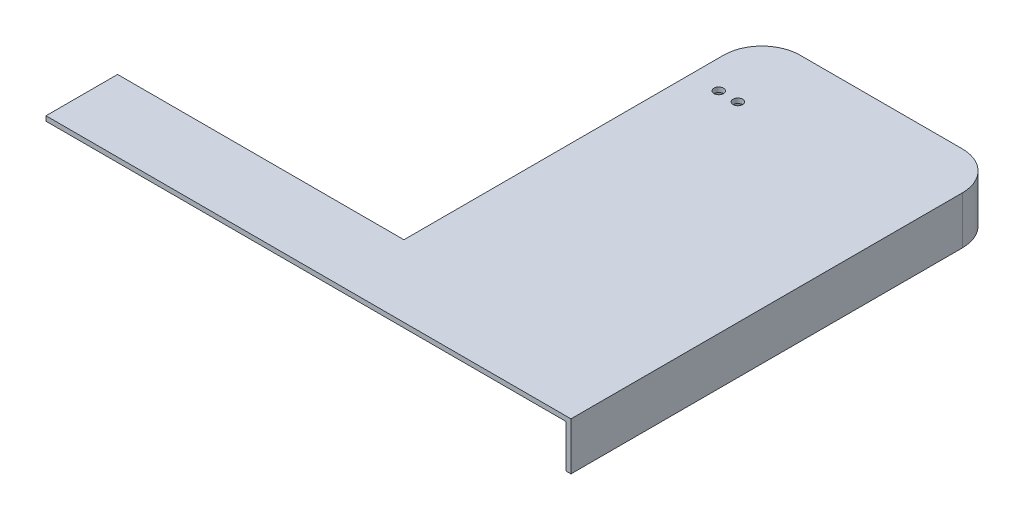
ISO-10303-21;
HEADER;
FILE_DESCRIPTION(('STEP AP214'),'2;1');
FILE_NAME('part.step','',(''),(''),'','','');
FILE_SCHEMA(('AUTOMOTIVE_DESIGN { 1 0 10303 214 1 1 1 1 }'));
ENDSEC;
DATA;
#1=APPLICATION_CONTEXT('core data for automotive mechanical design processes');
#2=APPLICATION_PROTOCOL_DEFINITION('international standard','automotive_design',2000,#1);
#3=PRODUCT_CONTEXT('',#1,'mechanical');
#4=PRODUCT('Part','Part','',(#3));
#5=PRODUCT_RELATED_PRODUCT_CATEGORY('part','',(#4));
#6=PRODUCT_DEFINITION_FORMATION('','',#4);
#7=PRODUCT_DEFINITION_CONTEXT('part definition',#1,'design');
#8=PRODUCT_DEFINITION('design','',#6,#7);
#9=PRODUCT_DEFINITION_SHAPE('','',#8);
#10=(LENGTH_UNIT() NAMED_UNIT(*) SI_UNIT(.MILLI.,.METRE.));
#11=(NAMED_UNIT(*) PLANE_ANGLE_UNIT() SI_UNIT($,.RADIAN.));
#12=(NAMED_UNIT(*) SI_UNIT($,.STERADIAN.) SOLID_ANGLE_UNIT());
#13=UNCERTAINTY_MEASURE_WITH_UNIT(LENGTH_MEASURE(1.E-05),#10,'distance_accuracy_value','');
#14=(GEOMETRIC_REPRESENTATION_CONTEXT(3) GLOBAL_UNCERTAINTY_ASSIGNED_CONTEXT((#13)) GLOBAL_UNIT_ASSIGNED_CONTEXT((#10,
#11,#12)) REPRESENTATION_CONTEXT('',''));
#15=CARTESIAN_POINT('',(0.,0.,0.));
#16=DIRECTION('',(0.,0.,1.));
#17=DIRECTION('',(1.,0.,0.));
#18=AXIS2_PLACEMENT_3D('',#15,#16,#17);
#19=CARTESIAN_POINT('',(0.,25.4,-12.7));
#20=DIRECTION('',(0.,0.,-1.));
#21=DIRECTION('',(-1.,0.,0.));
#22=AXIS2_PLACEMENT_3D('',#19,#20,#21);
#23=PLANE('',#22);
#24=DIRECTION('',(1.,0.,0.));
#25=VECTOR('',#24,1.);
#26=CARTESIAN_POINT('',(0.,0.,-12.7));
#27=LINE('',#26,#25);
#28=CARTESIAN_POINT('',(0.,0.,-12.7));
#29=VERTEX_POINT('',#28);
#30=CARTESIAN_POINT('',(152.4,0.,-12.7));
#31=VERTEX_POINT('',#30);
#32=EDGE_CURVE('E166',#29,#31,#27,.T.);
#33=ORIENTED_EDGE('',*,*,#32,.F.);
#34=DIRECTION('',(0.,1.,0.));
#35=VECTOR('',#34,1.);
#36=CARTESIAN_POINT('',(0.,0.,-12.7));
#37=LINE('',#36,#35);
#38=CARTESIAN_POINT('',(0.,25.4,-12.7));
#39=VERTEX_POINT('',#38);
#40=EDGE_CURVE('E148',#29,#39,#37,.T.);
#41=ORIENTED_EDGE('',*,*,#40,.T.);
#42=DIRECTION('',(1.,0.,0.));
#43=VECTOR('',#42,1.);
#44=CARTESIAN_POINT('',(0.,25.4,-12.7));
#45=LINE('',#44,#43);
#46=CARTESIAN_POINT('',(152.4,25.4,-12.7));
#47=VERTEX_POINT('',#46);
#48=EDGE_CURVE('E319',#39,#47,#45,.T.);
#49=ORIENTED_EDGE('',*,*,#48,.T.);
#50=DIRECTION('',(0.,-1.,0.));
#51=VECTOR('',#50,1.);
#52=CARTESIAN_POINT('',(152.4,25.4,-12.7));
#53=LINE('',#52,#51);
#54=EDGE_CURVE('E174',#47,#31,#53,.T.);
#55=ORIENTED_EDGE('',*,*,#54,.T.);
#56=EDGE_LOOP('',(#33,#41,#49,#55));
#57=FACE_BOUND('',#56,.T.);
#58=ADVANCED_FACE('F40',(#57),#23,.T.);
#59=CARTESIAN_POINT('',(0.,25.4,0.));
#60=DIRECTION('',(0.,1.,0.));
#61=DIRECTION('',(0.,0.,1.));
#62=AXIS2_PLACEMENT_3D('',#59,#60,#61);
#63=PLANE('',#62);
#64=CARTESIAN_POINT('',(177.72,25.4,-165.1));
#65=DIRECTION('',(0.,1.,0.));
#66=DIRECTION('',(0.,0.,1.));
#67=AXIS2_PLACEMENT_3D('',#64,#65,#66);
#68=CIRCLE('',#67,2.54000000000001);
#69=CARTESIAN_POINT('',(177.72,25.4,-162.56));
#70=VERTEX_POINT('',#69);
#71=EDGE_CURVE('E251',#70,#70,#68,.T.);
#72=ORIENTED_EDGE('',*,*,#71,.F.);
#73=EDGE_LOOP('',(#72));
#74=FACE_BOUND('',#73,.T.);
#75=CARTESIAN_POINT('',(167.56,25.4,-165.1));
#76=DIRECTION('',(0.,1.,0.));
#77=DIRECTION('',(0.,0.,1.));
#78=AXIS2_PLACEMENT_3D('',#75,#76,#77);
#79=CIRCLE('',#78,2.54000000000001);
#80=CARTESIAN_POINT('',(167.56,25.4,-162.56));
#81=VERTEX_POINT('',#80);
#82=EDGE_CURVE('E223',#81,#81,#79,.T.);
#83=ORIENTED_EDGE('',*,*,#82,.F.);
#84=EDGE_LOOP('',(#83));
#85=FACE_BOUND('',#84,.T.);
#86=ORIENTED_EDGE('',*,*,#48,.F.);
#87=DIRECTION('',(0.,0.,1.));
#88=VECTOR('',#87,1.);
#89=CARTESIAN_POINT('',(0.,25.4,0.));
#90=LINE('',#89,#88);
#91=CARTESIAN_POINT('',(0.,25.4,25.4));
#92=VERTEX_POINT('',#91);
#93=EDGE_CURVE('E154',#39,#92,#90,.T.);
#94=ORIENTED_EDGE('',*,*,#93,.T.);
#95=DIRECTION('',(-1.,0.,0.));
#96=VECTOR('',#95,1.);
#97=CARTESIAN_POINT('',(0.,25.4,25.4));
#98=LINE('',#97,#96);
#99=CARTESIAN_POINT('',(279.4,25.4,25.4));
#100=VERTEX_POINT('',#99);
#101=EDGE_CURVE('E170',#100,#92,#98,.T.);
#102=ORIENTED_EDGE('',*,*,#101,.F.);
#103=DIRECTION('',(0.,0.,-1.));
#104=VECTOR('',#103,1.);
#105=CARTESIAN_POINT('',(279.4,25.4,0.));
#106=LINE('',#105,#104);
#107=CARTESIAN_POINT('',(279.4,25.4,-182.88));
#108=VERTEX_POINT('',#107);
#109=EDGE_CURVE('E190',#100,#108,#106,.T.);
#110=ORIENTED_EDGE('',*,*,#109,.T.);
#111=CARTESIAN_POINT('',(259.08,25.4,-182.88));
#112=DIRECTION('',(0.,1.,0.));
#113=DIRECTION('',(0.,0.,1.));
#114=AXIS2_PLACEMENT_3D('',#111,#112,#113);
#115=CIRCLE('',#114,20.32);
#116=CARTESIAN_POINT('',(259.08,25.4,-203.2));
#117=VERTEX_POINT('',#116);
#118=EDGE_CURVE('E211',#108,#117,#115,.T.);
#119=ORIENTED_EDGE('',*,*,#118,.T.);
#120=DIRECTION('',(1.,0.,0.));
#121=VECTOR('',#120,1.);
#122=CARTESIAN_POINT('',(0.,25.4,-203.2));
#123=LINE('',#122,#121);
#124=CARTESIAN_POINT('',(172.72,25.4,-203.2));
#125=VERTEX_POINT('',#124);
#126=EDGE_CURVE('E181',#125,#117,#123,.T.);
#127=ORIENTED_EDGE('',*,*,#126,.F.);
#128=CARTESIAN_POINT('',(172.72,25.4,-182.88));
#129=DIRECTION('',(0.,1.,0.));
#130=DIRECTION('',(0.,0.,1.));
#131=AXIS2_PLACEMENT_3D('',#128,#129,#130);
#132=CIRCLE('',#131,20.32);
#133=CARTESIAN_POINT('',(152.4,25.4,-182.88));
#134=VERTEX_POINT('',#133);
#135=EDGE_CURVE('E208',#125,#134,#132,.T.);
#136=ORIENTED_EDGE('',*,*,#135,.T.);
#137=DIRECTION('',(0.,0.,1.));
#138=VECTOR('',#137,1.);
#139=CARTESIAN_POINT('',(152.4,25.4,0.));
#140=LINE('',#139,#138);
#141=EDGE_CURVE('E315',#134,#47,#140,.T.);
#142=ORIENTED_EDGE('',*,*,#141,.T.);
#143=EDGE_LOOP('',(#86,#94,#102,#110,#119,#127,#136,#142));
#144=FACE_BOUND('',#143,.T.);
#145=ADVANCED_FACE('F338',(#74,#85,#144),#63,.T.);
#146=CARTESIAN_POINT('',(0.,0.,0.));
#147=DIRECTION('',(0.,1.,0.));
#148=DIRECTION('',(0.,0.,1.));
#149=AXIS2_PLACEMENT_3D('',#146,#147,#148);
#150=PLANE('',#149);
#151=DIRECTION('',(0.,0.,1.));
#152=VECTOR('',#151,1.);
#153=CARTESIAN_POINT('',(0.,0.,0.));
#154=LINE('',#153,#152);
#155=CARTESIAN_POINT('',(0.,0.,-10.16));
#156=VERTEX_POINT('',#155);
#157=EDGE_CURVE('E151',#29,#156,#154,.T.);
#158=ORIENTED_EDGE('',*,*,#157,.F.);
#159=ORIENTED_EDGE('',*,*,#32,.T.);
#160=DIRECTION('',(0.,0.,1.));
#161=VECTOR('',#160,1.);
#162=CARTESIAN_POINT('',(152.4,0.,0.));
#163=LINE('',#162,#161);
#164=CARTESIAN_POINT('',(152.4,0.,-182.88));
#165=VERTEX_POINT('',#164);
#166=EDGE_CURVE('E177',#165,#31,#163,.T.);
#167=ORIENTED_EDGE('',*,*,#166,.F.);
#168=CARTESIAN_POINT('',(172.72,0.,-182.88));
#169=DIRECTION('',(0.,1.,0.));
#170=DIRECTION('',(0.,0.,1.));
#171=AXIS2_PLACEMENT_3D('',#168,#169,#170);
#172=CIRCLE('',#171,20.32);
#173=CARTESIAN_POINT('',(172.72,0.,-203.2));
#174=VERTEX_POINT('',#173);
#175=EDGE_CURVE('E197',#165,#174,#172,.F.);
#176=ORIENTED_EDGE('',*,*,#175,.T.);
#177=DIRECTION('',(1.,0.,0.));
#178=VECTOR('',#177,1.);
#179=CARTESIAN_POINT('',(0.,0.,-203.2));
#180=LINE('',#179,#178);
#181=CARTESIAN_POINT('',(259.08,0.,-203.2));
#182=VERTEX_POINT('',#181);
#183=EDGE_CURVE('E183',#174,#182,#180,.T.);
#184=ORIENTED_EDGE('',*,*,#183,.T.);
#185=CARTESIAN_POINT('',(259.08,0.,-182.88));
#186=DIRECTION('',(0.,1.,0.));
#187=DIRECTION('',(0.,0.,1.));
#188=AXIS2_PLACEMENT_3D('',#185,#186,#187);
#189=CIRCLE('',#188,20.32);
#190=CARTESIAN_POINT('',(279.4,0.,-182.88));
#191=VERTEX_POINT('',#190);
#192=EDGE_CURVE('E200',#182,#191,#189,.F.);
#193=ORIENTED_EDGE('',*,*,#192,.T.);
#194=DIRECTION('',(0.,0.,-1.));
#195=VECTOR('',#194,1.);
#196=CARTESIAN_POINT('',(279.4,0.,0.));
#197=LINE('',#196,#195);
#198=CARTESIAN_POINT('',(279.4,0.,25.4));
#199=VERTEX_POINT('',#198);
#200=EDGE_CURVE('E176',#199,#191,#197,.T.);
#201=ORIENTED_EDGE('',*,*,#200,.F.);
#202=DIRECTION('',(-1.,0.,0.));
#203=VECTOR('',#202,1.);
#204=CARTESIAN_POINT('',(0.,0.,25.4));
#205=LINE('',#204,#203);
#206=CARTESIAN_POINT('',(276.86,0.,25.4));
#207=VERTEX_POINT('',#206);
#208=EDGE_CURVE('E160',#199,#207,#205,.T.);
#209=ORIENTED_EDGE('',*,*,#208,.T.);
#210=DIRECTION('',(0.,0.,-1.));
#211=VECTOR('',#210,1.);
#212=CARTESIAN_POINT('',(276.86,0.,0.));
#213=LINE('',#212,#211);
#214=CARTESIAN_POINT('',(276.86,0.,-182.88));
#215=VERTEX_POINT('',#214);
#216=EDGE_CURVE('E245',#207,#215,#213,.T.);
#217=ORIENTED_EDGE('',*,*,#216,.T.);
#218=CARTESIAN_POINT('',(259.08,0.,-182.88));
#219=DIRECTION('',(0.,1.,0.));
#220=DIRECTION('',(0.,0.,1.));
#221=AXIS2_PLACEMENT_3D('',#218,#219,#220);
#222=CIRCLE('',#221,17.78);
#223=CARTESIAN_POINT('',(259.08,0.,-200.66));
#224=VERTEX_POINT('',#223);
#225=EDGE_CURVE('E297',#224,#215,#222,.F.);
#226=ORIENTED_EDGE('',*,*,#225,.F.);
#227=DIRECTION('',(1.,0.,0.));
#228=VECTOR('',#227,1.);
#229=CARTESIAN_POINT('',(0.,0.,-200.66));
#230=LINE('',#229,#228);
#231=CARTESIAN_POINT('',(172.72,0.,-200.66));
#232=VERTEX_POINT('',#231);
#233=EDGE_CURVE('E226',#232,#224,#230,.T.);
#234=ORIENTED_EDGE('',*,*,#233,.F.);
#235=CARTESIAN_POINT('',(172.72,0.,-182.88));
#236=DIRECTION('',(0.,1.,0.));
#237=DIRECTION('',(0.,0.,1.));
#238=AXIS2_PLACEMENT_3D('',#235,#236,#237);
#239=CIRCLE('',#238,17.78);
#240=CARTESIAN_POINT('',(154.94,0.,-182.88));
#241=VERTEX_POINT('',#240);
#242=EDGE_CURVE('E270',#241,#232,#239,.F.);
#243=ORIENTED_EDGE('',*,*,#242,.F.);
#244=DIRECTION('',(0.,0.,1.));
#245=VECTOR('',#244,1.);
#246=CARTESIAN_POINT('',(154.94,0.,0.));
#247=LINE('',#246,#245);
#248=CARTESIAN_POINT('',(154.94,0.,-10.16));
#249=VERTEX_POINT('',#248);
#250=EDGE_CURVE('E63',#241,#249,#247,.T.);
#251=ORIENTED_EDGE('',*,*,#250,.T.);
#252=DIRECTION('',(1.,0.,0.));
#253=VECTOR('',#252,1.);
#254=CARTESIAN_POINT('',(0.,0.,-10.16));
#255=LINE('',#254,#253);
#256=EDGE_CURVE('E168',#156,#249,#255,.T.);
#257=ORIENTED_EDGE('',*,*,#256,.F.);
#258=EDGE_LOOP('',(#158,#159,#167,#176,#184,#193,#201,#209,#217,#226,#234,#243,#251,#257));
#259=FACE_BOUND('',#258,.T.);
#260=ADVANCED_FACE('F164',(#259),#150,.F.);
#261=CARTESIAN_POINT('',(0.,25.4,-10.16));
#262=DIRECTION('',(0.,0.,-1.));
#263=DIRECTION('',(-1.,0.,0.));
#264=AXIS2_PLACEMENT_3D('',#261,#262,#263);
#265=PLANE('',#264);
#266=DIRECTION('',(0.,1.,0.));
#267=VECTOR('',#266,1.);
#268=CARTESIAN_POINT('',(0.,25.4,-10.16));
#269=LINE('',#268,#267);
#270=CARTESIAN_POINT('',(0.,22.86,-10.16));
#271=VERTEX_POINT('',#270);
#272=EDGE_CURVE('E247',#156,#271,#269,.T.);
#273=ORIENTED_EDGE('',*,*,#272,.F.);
#274=ORIENTED_EDGE('',*,*,#256,.T.);
#275=DIRECTION('',(0.,-1.,0.));
#276=VECTOR('',#275,1.);
#277=CARTESIAN_POINT('',(154.94,25.4,-10.16));
#278=LINE('',#277,#276);
#279=CARTESIAN_POINT('',(154.94,22.86,-10.16));
#280=VERTEX_POINT('',#279);
#281=EDGE_CURVE('E274',#280,#249,#278,.T.);
#282=ORIENTED_EDGE('',*,*,#281,.F.);
#283=DIRECTION('',(1.,0.,0.));
#284=VECTOR('',#283,1.);
#285=CARTESIAN_POINT('',(0.,22.86,-10.16));
#286=LINE('',#285,#284);
#287=EDGE_CURVE('E277',#271,#280,#286,.T.);
#288=ORIENTED_EDGE('',*,*,#287,.F.);
#289=EDGE_LOOP('',(#273,#274,#282,#288));
#290=FACE_BOUND('',#289,.T.);
#291=ADVANCED_FACE('F363',(#290),#265,.F.);
#292=CARTESIAN_POINT('',(0.,22.86,0.));
#293=DIRECTION('',(0.,1.,0.));
#294=DIRECTION('',(0.,0.,1.));
#295=AXIS2_PLACEMENT_3D('',#292,#293,#294);
#296=PLANE('',#295);
#297=CARTESIAN_POINT('',(177.72,22.86,-165.1));
#298=DIRECTION('',(0.,1.,0.));
#299=DIRECTION('',(0.,0.,1.));
#300=AXIS2_PLACEMENT_3D('',#297,#298,#299);
#301=CIRCLE('',#300,2.54000000000001);
#302=CARTESIAN_POINT('',(177.72,22.86,-162.56));
#303=VERTEX_POINT('',#302);
#304=EDGE_CURVE('E218',#303,#303,#301,.T.);
#305=ORIENTED_EDGE('',*,*,#304,.T.);
#306=EDGE_LOOP('',(#305));
#307=FACE_BOUND('',#306,.T.);
#308=CARTESIAN_POINT('',(167.56,22.86,-165.1));
#309=DIRECTION('',(0.,1.,0.));
#310=DIRECTION('',(0.,0.,1.));
#311=AXIS2_PLACEMENT_3D('',#308,#309,#310);
#312=CIRCLE('',#311,2.54000000000001);
#313=CARTESIAN_POINT('',(167.56,22.86,-162.56));
#314=VERTEX_POINT('',#313);
#315=EDGE_CURVE('E222',#314,#314,#312,.T.);
#316=ORIENTED_EDGE('',*,*,#315,.T.);
#317=EDGE_LOOP('',(#316));
#318=FACE_BOUND('',#317,.T.);
#319=DIRECTION('',(0.,0.,1.));
#320=VECTOR('',#319,1.);
#321=CARTESIAN_POINT('',(0.,22.86,0.));
#322=LINE('',#321,#320);
#323=CARTESIAN_POINT('',(0.,22.86,25.4));
#324=VERTEX_POINT('',#323);
#325=EDGE_CURVE('E11',#271,#324,#322,.T.);
#326=ORIENTED_EDGE('',*,*,#325,.F.);
#327=ORIENTED_EDGE('',*,*,#287,.T.);
#328=DIRECTION('',(0.,0.,1.));
#329=VECTOR('',#328,1.);
#330=CARTESIAN_POINT('',(154.94,22.86,0.));
#331=LINE('',#330,#329);
#332=CARTESIAN_POINT('',(154.94,22.86,-182.88));
#333=VERTEX_POINT('',#332);
#334=EDGE_CURVE('E266',#333,#280,#331,.T.);
#335=ORIENTED_EDGE('',*,*,#334,.F.);
#336=CARTESIAN_POINT('',(172.72,22.86,-182.88));
#337=DIRECTION('',(0.,1.,0.));
#338=DIRECTION('',(0.,0.,1.));
#339=AXIS2_PLACEMENT_3D('',#336,#337,#338);
#340=CIRCLE('',#339,17.78);
#341=CARTESIAN_POINT('',(172.72,22.86,-200.66));
#342=VERTEX_POINT('',#341);
#343=EDGE_CURVE('E282',#342,#333,#340,.T.);
#344=ORIENTED_EDGE('',*,*,#343,.F.);
#345=DIRECTION('',(1.,0.,0.));
#346=VECTOR('',#345,1.);
#347=CARTESIAN_POINT('',(0.,22.86,-200.66));
#348=LINE('',#347,#346);
#349=CARTESIAN_POINT('',(259.08,22.86,-200.66));
#350=VERTEX_POINT('',#349);
#351=EDGE_CURVE('E262',#342,#350,#348,.T.);
#352=ORIENTED_EDGE('',*,*,#351,.T.);
#353=CARTESIAN_POINT('',(259.08,22.86,-182.88));
#354=DIRECTION('',(0.,1.,0.));
#355=DIRECTION('',(0.,0.,1.));
#356=AXIS2_PLACEMENT_3D('',#353,#354,#355);
#357=CIRCLE('',#356,17.78);
#358=CARTESIAN_POINT('',(276.86,22.86,-182.88));
#359=VERTEX_POINT('',#358);
#360=EDGE_CURVE('E278',#359,#350,#357,.T.);
#361=ORIENTED_EDGE('',*,*,#360,.F.);
#362=DIRECTION('',(0.,0.,-1.));
#363=VECTOR('',#362,1.);
#364=CARTESIAN_POINT('',(276.86,22.86,0.));
#365=LINE('',#364,#363);
#366=CARTESIAN_POINT('',(276.86,22.86,25.4));
#367=VERTEX_POINT('',#366);
#368=EDGE_CURVE('E235',#367,#359,#365,.T.);
#369=ORIENTED_EDGE('',*,*,#368,.F.);
#370=DIRECTION('',(-1.,0.,0.));
#371=VECTOR('',#370,1.);
#372=CARTESIAN_POINT('',(0.,22.86,25.4));
#373=LINE('',#372,#371);
#374=EDGE_CURVE('E49',#367,#324,#373,.T.);
#375=ORIENTED_EDGE('',*,*,#374,.T.);
#376=EDGE_LOOP('',(#326,#327,#335,#344,#352,#361,#369,#375));
#377=FACE_BOUND('',#376,.T.);
#378=ADVANCED_FACE('F232',(#307,#318,#377),#296,.F.);
#379=CARTESIAN_POINT('',(0.,25.4,-203.2));
#380=DIRECTION('',(0.,0.,-1.));
#381=DIRECTION('',(-1.,0.,0.));
#382=AXIS2_PLACEMENT_3D('',#379,#380,#381);
#383=PLANE('',#382);
#384=ORIENTED_EDGE('',*,*,#126,.T.);
#385=DIRECTION('',(0.,-1.,0.));
#386=VECTOR('',#385,1.);
#387=CARTESIAN_POINT('',(259.08,0.,-203.2));
#388=LINE('',#387,#386);
#389=EDGE_CURVE('E193',#117,#182,#388,.T.);
#390=ORIENTED_EDGE('',*,*,#389,.T.);
#391=ORIENTED_EDGE('',*,*,#183,.F.);
#392=DIRECTION('',(0.,-1.,0.));
#393=VECTOR('',#392,1.);
#394=CARTESIAN_POINT('',(172.72,25.4,-203.2));
#395=LINE('',#394,#393);
#396=EDGE_CURVE('E189',#174,#125,#395,.F.);
#397=ORIENTED_EDGE('',*,*,#396,.T.);
#398=EDGE_LOOP('',(#384,#390,#391,#397));
#399=FACE_BOUND('',#398,.T.);
#400=ADVANCED_FACE('F330',(#399),#383,.T.);
#401=CARTESIAN_POINT('',(152.4,25.4,0.));
#402=DIRECTION('',(1.,0.,0.));
#403=DIRECTION('',(0.,0.,-1.));
#404=AXIS2_PLACEMENT_3D('',#401,#402,#403);
#405=PLANE('',#404);
#406=ORIENTED_EDGE('',*,*,#141,.F.);
#407=DIRECTION('',(0.,-1.,0.));
#408=VECTOR('',#407,1.);
#409=CARTESIAN_POINT('',(152.4,0.,-182.88));
#410=LINE('',#409,#408);
#411=EDGE_CURVE('E214',#134,#165,#410,.T.);
#412=ORIENTED_EDGE('',*,*,#411,.T.);
#413=ORIENTED_EDGE('',*,*,#166,.T.);
#414=ORIENTED_EDGE('',*,*,#54,.F.);
#415=EDGE_LOOP('',(#406,#412,#413,#414));
#416=FACE_BOUND('',#415,.T.);
#417=ADVANCED_FACE('F340',(#416),#405,.F.);
#418=CARTESIAN_POINT('',(279.4,25.4,0.));
#419=DIRECTION('',(-1.,0.,0.));
#420=DIRECTION('',(0.,0.,1.));
#421=AXIS2_PLACEMENT_3D('',#418,#419,#420);
#422=PLANE('',#421);
#423=ORIENTED_EDGE('',*,*,#109,.F.);
#424=DIRECTION('',(0.,1.,0.));
#425=VECTOR('',#424,1.);
#426=CARTESIAN_POINT('',(279.4,0.,25.4));
#427=LINE('',#426,#425);
#428=EDGE_CURVE('E159',#199,#100,#427,.T.);
#429=ORIENTED_EDGE('',*,*,#428,.F.);
#430=ORIENTED_EDGE('',*,*,#200,.T.);
#431=DIRECTION('',(0.,-1.,0.));
#432=VECTOR('',#431,1.);
#433=CARTESIAN_POINT('',(279.4,25.4,-182.88));
#434=LINE('',#433,#432);
#435=EDGE_CURVE('E204',#191,#108,#434,.F.);
#436=ORIENTED_EDGE('',*,*,#435,.T.);
#437=EDGE_LOOP('',(#423,#429,#430,#436));
#438=FACE_BOUND('',#437,.T.);
#439=ADVANCED_FACE('F342',(#438),#422,.F.);
#440=CARTESIAN_POINT('',(259.08,25.4,-182.88));
#441=DIRECTION('',(0.,1.,0.));
#442=DIRECTION('',(0.,0.,1.));
#443=AXIS2_PLACEMENT_3D('',#440,#441,#442);
#444=CYLINDRICAL_SURFACE('',#443,20.32);
#445=ORIENTED_EDGE('',*,*,#118,.F.);
#446=ORIENTED_EDGE('',*,*,#435,.F.);
#447=ORIENTED_EDGE('',*,*,#192,.F.);
#448=ORIENTED_EDGE('',*,*,#389,.F.);
#449=EDGE_LOOP('',(#445,#446,#447,#448));
#450=FACE_BOUND('',#449,.T.);
#451=ADVANCED_FACE('F349',(#450),#444,.T.);
#452=CARTESIAN_POINT('',(172.72,25.4,-182.88));
#453=DIRECTION('',(0.,1.,0.));
#454=DIRECTION('',(0.,0.,1.));
#455=AXIS2_PLACEMENT_3D('',#452,#453,#454);
#456=CYLINDRICAL_SURFACE('',#455,20.32);
#457=ORIENTED_EDGE('',*,*,#135,.F.);
#458=ORIENTED_EDGE('',*,*,#396,.F.);
#459=ORIENTED_EDGE('',*,*,#175,.F.);
#460=ORIENTED_EDGE('',*,*,#411,.F.);
#461=EDGE_LOOP('',(#457,#458,#459,#460));
#462=FACE_BOUND('',#461,.T.);
#463=ADVANCED_FACE('F42',(#462),#456,.T.);
#464=CARTESIAN_POINT('',(0.,25.4,-200.66));
#465=DIRECTION('',(0.,0.,-1.));
#466=DIRECTION('',(-1.,0.,0.));
#467=AXIS2_PLACEMENT_3D('',#464,#465,#466);
#468=PLANE('',#467);
#469=ORIENTED_EDGE('',*,*,#351,.F.);
#470=DIRECTION('',(0.,1.,0.));
#471=VECTOR('',#470,1.);
#472=CARTESIAN_POINT('',(172.72,25.4,-200.66));
#473=LINE('',#472,#471);
#474=EDGE_CURVE('E271',#232,#342,#473,.T.);
#475=ORIENTED_EDGE('',*,*,#474,.F.);
#476=ORIENTED_EDGE('',*,*,#233,.T.);
#477=DIRECTION('',(0.,1.,0.));
#478=VECTOR('',#477,1.);
#479=CARTESIAN_POINT('',(259.08,25.4,-200.66));
#480=LINE('',#479,#478);
#481=EDGE_CURVE('E267',#350,#224,#480,.F.);
#482=ORIENTED_EDGE('',*,*,#481,.F.);
#483=EDGE_LOOP('',(#469,#475,#476,#482));
#484=FACE_BOUND('',#483,.T.);
#485=ADVANCED_FACE('F385',(#484),#468,.F.);
#486=CARTESIAN_POINT('',(154.94,25.4,0.));
#487=DIRECTION('',(1.,0.,0.));
#488=DIRECTION('',(0.,0.,-1.));
#489=AXIS2_PLACEMENT_3D('',#486,#487,#488);
#490=PLANE('',#489);
#491=ORIENTED_EDGE('',*,*,#334,.T.);
#492=ORIENTED_EDGE('',*,*,#281,.T.);
#493=ORIENTED_EDGE('',*,*,#250,.F.);
#494=DIRECTION('',(0.,1.,0.));
#495=VECTOR('',#494,1.);
#496=CARTESIAN_POINT('',(154.94,25.4,-182.88));
#497=LINE('',#496,#495);
#498=EDGE_CURVE('E281',#333,#241,#497,.F.);
#499=ORIENTED_EDGE('',*,*,#498,.F.);
#500=EDGE_LOOP('',(#491,#492,#493,#499));
#501=FACE_BOUND('',#500,.T.);
#502=ADVANCED_FACE('F379',(#501),#490,.T.);
#503=CARTESIAN_POINT('',(276.86,25.4,0.));
#504=DIRECTION('',(-1.,0.,0.));
#505=DIRECTION('',(0.,0.,1.));
#506=AXIS2_PLACEMENT_3D('',#503,#504,#505);
#507=PLANE('',#506);
#508=DIRECTION('',(0.,-1.,0.));
#509=VECTOR('',#508,1.);
#510=CARTESIAN_POINT('',(276.86,25.4,25.4));
#511=LINE('',#510,#509);
#512=EDGE_CURVE('E238',#367,#207,#511,.T.);
#513=ORIENTED_EDGE('',*,*,#512,.F.);
#514=ORIENTED_EDGE('',*,*,#368,.T.);
#515=DIRECTION('',(0.,1.,0.));
#516=VECTOR('',#515,1.);
#517=CARTESIAN_POINT('',(276.86,25.4,-182.88));
#518=LINE('',#517,#516);
#519=EDGE_CURVE('E285',#215,#359,#518,.T.);
#520=ORIENTED_EDGE('',*,*,#519,.F.);
#521=ORIENTED_EDGE('',*,*,#216,.F.);
#522=EDGE_LOOP('',(#513,#514,#520,#521));
#523=FACE_BOUND('',#522,.T.);
#524=ADVANCED_FACE('F242',(#523),#507,.T.);
#525=CARTESIAN_POINT('',(259.08,25.4,-182.88));
#526=DIRECTION('',(0.,1.,0.));
#527=DIRECTION('',(0.,0.,1.));
#528=AXIS2_PLACEMENT_3D('',#525,#526,#527);
#529=CYLINDRICAL_SURFACE('',#528,17.78);
#530=ORIENTED_EDGE('',*,*,#360,.T.);
#531=ORIENTED_EDGE('',*,*,#481,.T.);
#532=ORIENTED_EDGE('',*,*,#225,.T.);
#533=ORIENTED_EDGE('',*,*,#519,.T.);
#534=EDGE_LOOP('',(#530,#531,#532,#533));
#535=FACE_BOUND('',#534,.T.);
#536=ADVANCED_FACE('F369',(#535),#529,.F.);
#537=CARTESIAN_POINT('',(172.72,25.4,-182.88));
#538=DIRECTION('',(0.,1.,0.));
#539=DIRECTION('',(0.,0.,1.));
#540=AXIS2_PLACEMENT_3D('',#537,#538,#539);
#541=CYLINDRICAL_SURFACE('',#540,17.78);
#542=ORIENTED_EDGE('',*,*,#343,.T.);
#543=ORIENTED_EDGE('',*,*,#498,.T.);
#544=ORIENTED_EDGE('',*,*,#242,.T.);
#545=ORIENTED_EDGE('',*,*,#474,.T.);
#546=EDGE_LOOP('',(#542,#543,#544,#545));
#547=FACE_BOUND('',#546,.T.);
#548=ADVANCED_FACE('F365',(#547),#541,.F.);
#549=CARTESIAN_POINT('',(177.72,0.,-165.1));
#550=DIRECTION('',(0.,1.,0.));
#551=DIRECTION('',(0.,0.,1.));
#552=AXIS2_PLACEMENT_3D('',#549,#550,#551);
#553=CYLINDRICAL_SURFACE('',#552,2.54000000000001);
#554=ORIENTED_EDGE('',*,*,#71,.T.);
#555=EDGE_LOOP('',(#554));
#556=FACE_BOUND('',#555,.T.);
#557=ORIENTED_EDGE('',*,*,#304,.F.);
#558=EDGE_LOOP('',(#557));
#559=FACE_BOUND('',#558,.T.);
#560=ADVANCED_FACE('F368',(#556,#559),#553,.F.);
#561=CARTESIAN_POINT('',(167.56,0.,-165.1));
#562=DIRECTION('',(0.,1.,0.));
#563=DIRECTION('',(0.,0.,1.));
#564=AXIS2_PLACEMENT_3D('',#561,#562,#563);
#565=CYLINDRICAL_SURFACE('',#564,2.54000000000001);
#566=ORIENTED_EDGE('',*,*,#82,.T.);
#567=EDGE_LOOP('',(#566));
#568=FACE_BOUND('',#567,.T.);
#569=ORIENTED_EDGE('',*,*,#315,.F.);
#570=EDGE_LOOP('',(#569));
#571=FACE_BOUND('',#570,.T.);
#572=ADVANCED_FACE('F391',(#568,#571),#565,.F.);
#573=CARTESIAN_POINT('',(0.,0.,0.));
#574=DIRECTION('',(-1.,0.,0.));
#575=DIRECTION('',(0.,0.,1.));
#576=AXIS2_PLACEMENT_3D('',#573,#574,#575);
#577=PLANE('',#576);
#578=ORIENTED_EDGE('',*,*,#272,.T.);
#579=ORIENTED_EDGE('',*,*,#325,.T.);
#580=DIRECTION('',(0.,1.,0.));
#581=VECTOR('',#580,1.);
#582=CARTESIAN_POINT('',(0.,0.,25.4));
#583=LINE('',#582,#581);
#584=EDGE_CURVE('E56',#324,#92,#583,.T.);
#585=ORIENTED_EDGE('',*,*,#584,.T.);
#586=ORIENTED_EDGE('',*,*,#93,.F.);
#587=ORIENTED_EDGE('',*,*,#40,.F.);
#588=ORIENTED_EDGE('',*,*,#157,.T.);
#589=EDGE_LOOP('',(#578,#579,#585,#586,#587,#588));
#590=FACE_BOUND('',#589,.T.);
#591=ADVANCED_FACE('F150',(#590),#577,.T.);
#592=CARTESIAN_POINT('',(0.,0.,25.4));
#593=DIRECTION('',(0.,0.,-1.));
#594=DIRECTION('',(-1.,0.,0.));
#595=AXIS2_PLACEMENT_3D('',#592,#593,#594);
#596=PLANE('',#595);
#597=ORIENTED_EDGE('',*,*,#512,.T.);
#598=ORIENTED_EDGE('',*,*,#208,.F.);
#599=ORIENTED_EDGE('',*,*,#428,.T.);
#600=ORIENTED_EDGE('',*,*,#101,.T.);
#601=ORIENTED_EDGE('',*,*,#584,.F.);
#602=ORIENTED_EDGE('',*,*,#374,.F.);
#603=EDGE_LOOP('',(#597,#598,#599,#600,#601,#602));
#604=FACE_BOUND('',#603,.T.);
#605=ADVANCED_FACE('F237',(#604),#596,.F.);
#606=CLOSED_SHELL('',(#58,#145,#260,#291,#378,#400,#417,#439,#451,#463,#485,#502,#524,#536,#548,
#560,#572,#591,#605));
#607=MANIFOLD_SOLID_BREP('B2',#606);
#608=ADVANCED_BREP_SHAPE_REPRESENTATION('',(#18,#607),#14);
#609=SHAPE_DEFINITION_REPRESENTATION(#9,#608);
ENDSEC;
END-ISO-10303-21;
